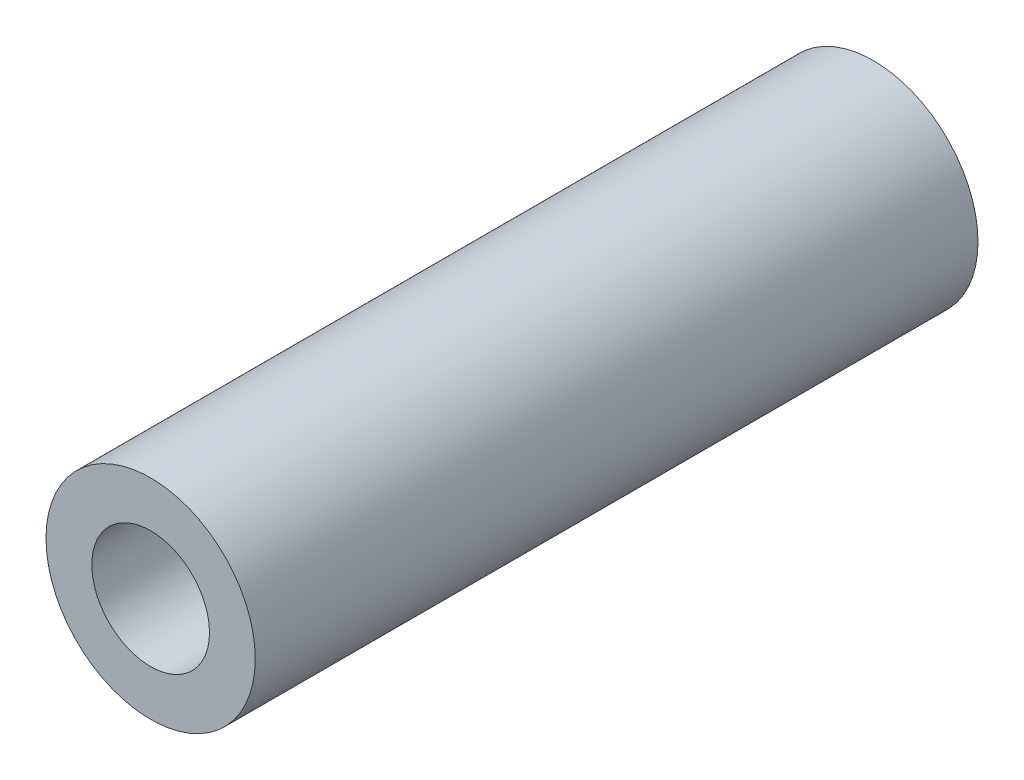
ISO-10303-21;
HEADER;
FILE_DESCRIPTION(('STEP AP214'),'2;1');
FILE_NAME('part.step','',(''),(''),'','','');
FILE_SCHEMA(('AUTOMOTIVE_DESIGN { 1 0 10303 214 1 1 1 1 }'));
ENDSEC;
DATA;
#1=APPLICATION_CONTEXT('core data for automotive mechanical design processes');
#2=APPLICATION_PROTOCOL_DEFINITION('international standard','automotive_design',2000,#1);
#3=PRODUCT_CONTEXT('',#1,'mechanical');
#4=PRODUCT('Part','Part','',(#3));
#5=PRODUCT_RELATED_PRODUCT_CATEGORY('part','',(#4));
#6=PRODUCT_DEFINITION_FORMATION('','',#4);
#7=PRODUCT_DEFINITION_CONTEXT('part definition',#1,'design');
#8=PRODUCT_DEFINITION('design','',#6,#7);
#9=PRODUCT_DEFINITION_SHAPE('','',#8);
#10=(LENGTH_UNIT() NAMED_UNIT(*) SI_UNIT(.MILLI.,.METRE.));
#11=(NAMED_UNIT(*) PLANE_ANGLE_UNIT() SI_UNIT($,.RADIAN.));
#12=(NAMED_UNIT(*) SI_UNIT($,.STERADIAN.) SOLID_ANGLE_UNIT());
#13=UNCERTAINTY_MEASURE_WITH_UNIT(LENGTH_MEASURE(1.E-05),#10,'distance_accuracy_value','');
#14=(GEOMETRIC_REPRESENTATION_CONTEXT(3) GLOBAL_UNCERTAINTY_ASSIGNED_CONTEXT((#13)) GLOBAL_UNIT_ASSIGNED_CONTEXT((#10,
#11,#12)) REPRESENTATION_CONTEXT('',''));
#15=CARTESIAN_POINT('',(0.,0.,0.));
#16=DIRECTION('',(0.,0.,1.));
#17=DIRECTION('',(1.,0.,0.));
#18=AXIS2_PLACEMENT_3D('',#15,#16,#17);
#19=CARTESIAN_POINT('',(51.2,50.6,27.25));
#20=DIRECTION('',(0.,0.,1.));
#21=DIRECTION('',(1.,0.,0.));
#22=AXIS2_PLACEMENT_3D('',#19,#20,#21);
#23=CYLINDRICAL_SURFACE('',#22,2.7);
#24=DIRECTION('',(0.,0.,1.));
#25=VECTOR('',#24,1.);
#26=CARTESIAN_POINT('',(53.9,50.6,27.25));
#27=LINE('',#26,#25);
#28=CARTESIAN_POINT('',(53.9,50.6,27.75));
#29=VERTEX_POINT('',#28);
#30=CARTESIAN_POINT('',(53.9,50.6,60.905110294118));
#31=VERTEX_POINT('',#30);
#32=EDGE_CURVE('E9',#29,#31,#27,.T.);
#33=ORIENTED_EDGE('',*,*,#32,.F.);
#34=CARTESIAN_POINT('',(51.2,50.6,27.75));
#35=DIRECTION('',(0.,0.,1.));
#36=DIRECTION('',(1.,0.,0.));
#37=AXIS2_PLACEMENT_3D('',#34,#35,#36);
#38=CIRCLE('',#37,2.7);
#39=EDGE_CURVE('E23',#29,#29,#38,.T.);
#40=ORIENTED_EDGE('',*,*,#39,.F.);
#41=ORIENTED_EDGE('',*,*,#32,.T.);
#42=CARTESIAN_POINT('',(51.2,50.6,60.905110294118));
#43=DIRECTION('',(0.,0.,1.));
#44=DIRECTION('',(1.,0.,0.));
#45=AXIS2_PLACEMENT_3D('',#42,#43,#44);
#46=CIRCLE('',#45,2.7);
#47=EDGE_CURVE('E64',#31,#31,#46,.T.);
#48=ORIENTED_EDGE('',*,*,#47,.T.);
#49=EDGE_LOOP('',(#33,#40,#41,#48));
#50=FACE_BOUND('',#49,.T.);
#51=ADVANCED_FACE('F14',(#50),#23,.F.);
#52=CARTESIAN_POINT('',(51.2,50.6,27.75));
#53=DIRECTION('',(0.,0.,1.));
#54=DIRECTION('',(1.,0.,0.));
#55=AXIS2_PLACEMENT_3D('',#52,#53,#54);
#56=PLANE('',#55);
#57=ORIENTED_EDGE('',*,*,#39,.T.);
#58=EDGE_LOOP('',(#57));
#59=FACE_BOUND('',#58,.T.);
#60=CARTESIAN_POINT('',(51.2,50.6,27.75));
#61=DIRECTION('',(0.,0.,1.));
#62=DIRECTION('',(1.,0.,0.));
#63=AXIS2_PLACEMENT_3D('',#60,#61,#62);
#64=CIRCLE('',#63,4.8);
#65=CARTESIAN_POINT('',(56.,50.6,27.75));
#66=VERTEX_POINT('',#65);
#67=EDGE_CURVE('E17',#66,#66,#64,.T.);
#68=ORIENTED_EDGE('',*,*,#67,.F.);
#69=EDGE_LOOP('',(#68));
#70=FACE_BOUND('',#69,.T.);
#71=ADVANCED_FACE('F69',(#59,#70),#56,.F.);
#72=CARTESIAN_POINT('',(51.2,50.6,60.905110294118));
#73=DIRECTION('',(0.,0.,1.));
#74=DIRECTION('',(1.,0.,0.));
#75=AXIS2_PLACEMENT_3D('',#72,#73,#74);
#76=PLANE('',#75);
#77=ORIENTED_EDGE('',*,*,#47,.F.);
#78=EDGE_LOOP('',(#77));
#79=FACE_BOUND('',#78,.T.);
#80=CARTESIAN_POINT('',(51.2,50.6,60.905110294118));
#81=DIRECTION('',(0.,0.,1.));
#82=DIRECTION('',(1.,0.,0.));
#83=AXIS2_PLACEMENT_3D('',#80,#81,#82);
#84=CIRCLE('',#83,4.8);
#85=CARTESIAN_POINT('',(56.,50.6,60.905110294118));
#86=VERTEX_POINT('',#85);
#87=EDGE_CURVE('E53',#86,#86,#84,.T.);
#88=ORIENTED_EDGE('',*,*,#87,.T.);
#89=EDGE_LOOP('',(#88));
#90=FACE_BOUND('',#89,.T.);
#91=ADVANCED_FACE('F58',(#79,#90),#76,.T.);
#92=CARTESIAN_POINT('',(51.2,50.6,27.75));
#93=DIRECTION('',(0.,0.,1.));
#94=DIRECTION('',(1.,0.,0.));
#95=AXIS2_PLACEMENT_3D('',#92,#93,#94);
#96=CYLINDRICAL_SURFACE('',#95,4.8);
#97=ORIENTED_EDGE('',*,*,#87,.F.);
#98=DIRECTION('',(0.,0.,1.));
#99=VECTOR('',#98,1.);
#100=CARTESIAN_POINT('',(56.,50.6,27.75));
#101=LINE('',#100,#99);
#102=EDGE_CURVE('E50',#66,#86,#101,.T.);
#103=ORIENTED_EDGE('',*,*,#102,.F.);
#104=ORIENTED_EDGE('',*,*,#67,.T.);
#105=ORIENTED_EDGE('',*,*,#102,.T.);
#106=EDGE_LOOP('',(#97,#103,#104,#105));
#107=FACE_BOUND('',#106,.T.);
#108=ADVANCED_FACE('F52',(#107),#96,.T.);
#109=CLOSED_SHELL('',(#51,#71,#91,#108));
#110=MANIFOLD_SOLID_BREP('B1',#109);
#111=ADVANCED_BREP_SHAPE_REPRESENTATION('',(#18,#110),#14);
#112=SHAPE_DEFINITION_REPRESENTATION(#9,#111);
ENDSEC;
END-ISO-10303-21;
